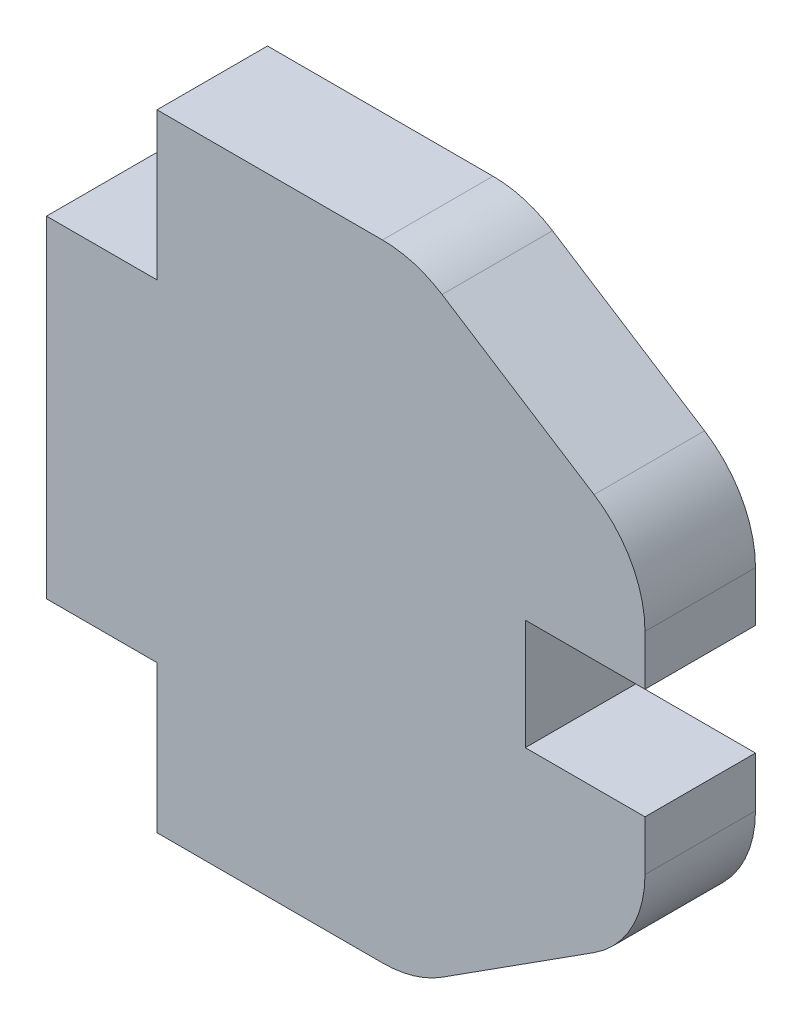
ISO-10303-21;
HEADER;
FILE_DESCRIPTION(('STEP AP214'),'2;1');
FILE_NAME('part.step','',(''),(''),'','','');
FILE_SCHEMA(('AUTOMOTIVE_DESIGN { 1 0 10303 214 1 1 1 1 }'));
ENDSEC;
DATA;
#1=APPLICATION_CONTEXT('core data for automotive mechanical design processes');
#2=APPLICATION_PROTOCOL_DEFINITION('international standard','automotive_design',2000,#1);
#3=PRODUCT_CONTEXT('',#1,'mechanical');
#4=PRODUCT('Part','Part','',(#3));
#5=PRODUCT_RELATED_PRODUCT_CATEGORY('part','',(#4));
#6=PRODUCT_DEFINITION_FORMATION('','',#4);
#7=PRODUCT_DEFINITION_CONTEXT('part definition',#1,'design');
#8=PRODUCT_DEFINITION('design','',#6,#7);
#9=PRODUCT_DEFINITION_SHAPE('','',#8);
#10=(LENGTH_UNIT() NAMED_UNIT(*) SI_UNIT(.MILLI.,.METRE.));
#11=(NAMED_UNIT(*) PLANE_ANGLE_UNIT() SI_UNIT($,.RADIAN.));
#12=(NAMED_UNIT(*) SI_UNIT($,.STERADIAN.) SOLID_ANGLE_UNIT());
#13=UNCERTAINTY_MEASURE_WITH_UNIT(LENGTH_MEASURE(1.E-05),#10,'distance_accuracy_value','');
#14=(GEOMETRIC_REPRESENTATION_CONTEXT(3) GLOBAL_UNCERTAINTY_ASSIGNED_CONTEXT((#13)) GLOBAL_UNIT_ASSIGNED_CONTEXT((#10,
#11,#12)) REPRESENTATION_CONTEXT('',''));
#15=CARTESIAN_POINT('',(0.,0.,0.));
#16=DIRECTION('',(0.,0.,1.));
#17=DIRECTION('',(1.,0.,0.));
#18=AXIS2_PLACEMENT_3D('',#15,#16,#17);
#19=CARTESIAN_POINT('',(6.1221212838,5.4999999982,0.));
#20=DIRECTION('',(0.,0.,1.));
#21=DIRECTION('',(1.,0.,0.));
#22=AXIS2_PLACEMENT_3D('',#19,#20,#21);
#23=CYLINDRICAL_SURFACE('',#22,2.9999999944);
#24=DIRECTION('',(0.,0.,-1.));
#25=VECTOR('',#24,1.);
#26=CARTESIAN_POINT('',(6.1221212838,8.4999999926,1.4999999972));
#27=LINE('',#26,#25);
#28=CARTESIAN_POINT('',(6.1221212838,8.4999999926,2.9999999944));
#29=VERTEX_POINT('',#28);
#30=CARTESIAN_POINT('',(6.1221212838,8.4999999926,0.));
#31=VERTEX_POINT('',#30);
#32=EDGE_CURVE('E101',#29,#31,#27,.T.);
#33=ORIENTED_EDGE('',*,*,#32,.F.);
#34=CARTESIAN_POINT('',(6.1221212838,5.4999999982,2.9999999944));
#35=DIRECTION('',(0.,0.,1.));
#36=DIRECTION('',(1.,0.,0.));
#37=AXIS2_PLACEMENT_3D('',#34,#35,#36);
#38=CIRCLE('',#37,2.9999999944);
#39=CARTESIAN_POINT('',(7.73939168209963,8.02674423565428,2.9999999944));
#40=VERTEX_POINT('',#39);
#41=EDGE_CURVE('E20',#40,#29,#38,.T.);
#42=ORIENTED_EDGE('',*,*,#41,.F.);
#43=DIRECTION('',(0.,0.,1.));
#44=VECTOR('',#43,1.);
#45=CARTESIAN_POINT('',(7.739391684,8.0267442462,1.4999999972));
#46=LINE('',#45,#44);
#47=CARTESIAN_POINT('',(7.73939168946474,8.02674424270224,0.));
#48=VERTEX_POINT('',#47);
#49=EDGE_CURVE('E102',#48,#40,#46,.T.);
#50=ORIENTED_EDGE('',*,*,#49,.F.);
#51=CARTESIAN_POINT('',(6.1221212838,5.4999999982,0.));
#52=DIRECTION('',(0.,0.,1.));
#53=DIRECTION('',(1.,0.,0.));
#54=AXIS2_PLACEMENT_3D('',#51,#52,#53);
#55=CIRCLE('',#54,2.9999999944);
#56=EDGE_CURVE('E106',#31,#48,#55,.F.);
#57=ORIENTED_EDGE('',*,*,#56,.F.);
#58=EDGE_LOOP('',(#33,#42,#50,#57));
#59=FACE_BOUND('',#58,.T.);
#60=ADVANCED_FACE('F16',(#59),#23,.T.);
#61=CARTESIAN_POINT('',(13.2494045146,1.4999999972,0.));
#62=DIRECTION('',(1.,0.,0.));
#63=DIRECTION('',(0.,1.,0.));
#64=AXIS2_PLACEMENT_3D('',#61,#62,#63);
#65=PLANE('',#64);
#66=DIRECTION('',(0.,-1.,0.));
#67=VECTOR('',#66,1.);
#68=CARTESIAN_POINT('',(13.2494045146,2.1791435081,2.9999999944));
#69=LINE('',#68,#67);
#70=CARTESIAN_POINT('',(13.2494045146,2.858287019,2.9999999944));
#71=VERTEX_POINT('',#70);
#72=CARTESIAN_POINT('',(13.2494045146,1.49999999707353,2.9999999944));
#73=VERTEX_POINT('',#72);
#74=EDGE_CURVE('E117',#71,#73,#69,.T.);
#75=ORIENTED_EDGE('',*,*,#74,.T.);
#76=DIRECTION('',(0.,0.,1.));
#77=VECTOR('',#76,1.);
#78=CARTESIAN_POINT('',(13.2494045146,1.4999999972,1.4999999972));
#79=LINE('',#78,#77);
#80=CARTESIAN_POINT('',(13.2494045146,1.49999999713677,0.));
#81=VERTEX_POINT('',#80);
#82=EDGE_CURVE('E202',#81,#73,#79,.T.);
#83=ORIENTED_EDGE('',*,*,#82,.F.);
#84=DIRECTION('',(0.,1.,0.));
#85=VECTOR('',#84,1.);
#86=CARTESIAN_POINT('',(13.2494045146,2.1791435081,0.));
#87=LINE('',#86,#85);
#88=CARTESIAN_POINT('',(13.2494045146,2.858287019,0.));
#89=VERTEX_POINT('',#88);
#90=EDGE_CURVE('E116',#81,#89,#87,.T.);
#91=ORIENTED_EDGE('',*,*,#90,.T.);
#92=DIRECTION('',(0.,0.,-1.));
#93=VECTOR('',#92,1.);
#94=CARTESIAN_POINT('',(13.2494045146,2.858287019,1.4999999972));
#95=LINE('',#94,#93);
#96=EDGE_CURVE('E88',#89,#71,#95,.F.);
#97=ORIENTED_EDGE('',*,*,#96,.T.);
#98=EDGE_LOOP('',(#75,#83,#91,#97));
#99=FACE_BOUND('',#98,.T.);
#100=ADVANCED_FACE('F386',(#99),#65,.T.);
#101=CARTESIAN_POINT('',(13.2494045146,-2.858287019,0.));
#102=DIRECTION('',(1.,0.,0.));
#103=DIRECTION('',(0.,1.,0.));
#104=AXIS2_PLACEMENT_3D('',#101,#102,#103);
#105=PLANE('',#104);
#106=DIRECTION('',(0.,-1.,0.));
#107=VECTOR('',#106,1.);
#108=CARTESIAN_POINT('',(13.2494045146,-2.1791435081,2.9999999944));
#109=LINE('',#108,#107);
#110=CARTESIAN_POINT('',(13.2494045146,-1.49999999703137,2.9999999944));
#111=VERTEX_POINT('',#110);
#112=CARTESIAN_POINT('',(13.2494045146,-2.85828701926938,2.9999999944));
#113=VERTEX_POINT('',#112);
#114=EDGE_CURVE('E246',#111,#113,#109,.T.);
#115=ORIENTED_EDGE('',*,*,#114,.T.);
#116=DIRECTION('',(0.,0.,1.));
#117=VECTOR('',#116,1.);
#118=CARTESIAN_POINT('',(13.2494045146,-2.85828701953876,1.4999999972));
#119=LINE('',#118,#117);
#120=CARTESIAN_POINT('',(13.2494045146,-2.85828701926938,0.));
#121=VERTEX_POINT('',#120);
#122=EDGE_CURVE('E107',#113,#121,#119,.F.);
#123=ORIENTED_EDGE('',*,*,#122,.T.);
#124=DIRECTION('',(0.,1.,0.));
#125=VECTOR('',#124,1.);
#126=CARTESIAN_POINT('',(13.2494045146,0.,0.));
#127=LINE('',#126,#125);
#128=CARTESIAN_POINT('',(13.2494045146,-1.49999999686275,0.));
#129=VERTEX_POINT('',#128);
#130=EDGE_CURVE('E114',#121,#129,#127,.T.);
#131=ORIENTED_EDGE('',*,*,#130,.T.);
#132=DIRECTION('',(0.,0.,-1.));
#133=VECTOR('',#132,1.);
#134=CARTESIAN_POINT('',(13.2494045146,-1.4999999972,1.4999999972));
#135=LINE('',#134,#133);
#136=EDGE_CURVE('E205',#111,#129,#135,.T.);
#137=ORIENTED_EDGE('',*,*,#136,.F.);
#138=EDGE_LOOP('',(#115,#123,#131,#137));
#139=FACE_BOUND('',#138,.T.);
#140=ADVANCED_FACE('F367',(#139),#105,.T.);
#141=CARTESIAN_POINT('',(10.2494045202,2.858287019,0.));
#142=DIRECTION('',(0.,0.,1.));
#143=DIRECTION('',(1.,0.,0.));
#144=AXIS2_PLACEMENT_3D('',#141,#142,#143);
#145=CYLINDRICAL_SURFACE('',#144,2.9999999944);
#146=DIRECTION('',(0.,0.,-1.));
#147=VECTOR('',#146,1.);
#148=CARTESIAN_POINT('',(11.8666749204,5.385031267,1.4999999972));
#149=LINE('',#148,#147);
#150=CARTESIAN_POINT('',(11.8666749206163,5.38503125976128,2.9999999944));
#151=VERTEX_POINT('',#150);
#152=CARTESIAN_POINT('',(11.8666749258647,5.38503126350224,0.));
#153=VERTEX_POINT('',#152);
#154=EDGE_CURVE('E68',#151,#153,#149,.T.);
#155=ORIENTED_EDGE('',*,*,#154,.F.);
#156=CARTESIAN_POINT('',(10.2494045202,2.858287019,2.9999999944));
#157=DIRECTION('',(0.,0.,1.));
#158=DIRECTION('',(1.,0.,0.));
#159=AXIS2_PLACEMENT_3D('',#156,#157,#158);
#160=CIRCLE('',#159,2.9999999944);
#161=EDGE_CURVE('E139',#71,#151,#160,.T.);
#162=ORIENTED_EDGE('',*,*,#161,.F.);
#163=ORIENTED_EDGE('',*,*,#96,.F.);
#164=CARTESIAN_POINT('',(10.2494045202,2.858287019,0.));
#165=DIRECTION('',(0.,0.,1.));
#166=DIRECTION('',(1.,0.,0.));
#167=AXIS2_PLACEMENT_3D('',#164,#165,#166);
#168=CIRCLE('',#167,2.9999999944);
#169=EDGE_CURVE('E85',#89,#153,#168,.T.);
#170=ORIENTED_EDGE('',*,*,#169,.T.);
#171=EDGE_LOOP('',(#155,#162,#163,#170));
#172=FACE_BOUND('',#171,.T.);
#173=ADVANCED_FACE('F86',(#172),#145,.T.);
#174=CARTESIAN_POINT('',(11.8666749204,5.385031267,0.));
#175=DIRECTION('',(0.539090135780362,0.842248078361899,0.));
#176=DIRECTION('',(-0.842248078361899,0.539090135780362,0.));
#177=AXIS2_PLACEMENT_3D('',#174,#175,#176);
#178=PLANE('',#177);
#179=DIRECTION('',(-0.842248079225794,0.539090134430653,0.));
#180=VECTOR('',#179,1.);
#181=CARTESIAN_POINT('',(11.866674908663,5.38503126031186,2.9999999944));
#182=LINE('',#181,#180);
#183=EDGE_CURVE('E99',#151,#40,#182,.T.);
#184=ORIENTED_EDGE('',*,*,#183,.F.);
#185=ORIENTED_EDGE('',*,*,#154,.T.);
#186=DIRECTION('',(-0.842248078361899,0.539090135780362,0.));
#187=VECTOR('',#186,1.);
#188=CARTESIAN_POINT('',(11.8666749204,5.385031267,0.));
#189=LINE('',#188,#187);
#190=EDGE_CURVE('E92',#153,#48,#189,.T.);
#191=ORIENTED_EDGE('',*,*,#190,.T.);
#192=ORIENTED_EDGE('',*,*,#49,.T.);
#193=EDGE_LOOP('',(#184,#185,#191,#192));
#194=FACE_BOUND('',#193,.T.);
#195=ADVANCED_FACE('F97',(#194),#178,.T.);
#196=CARTESIAN_POINT('',(6.1221212838,8.4999999926,0.));
#197=DIRECTION('',(0.,1.,0.));
#198=DIRECTION('',(-1.,0.,0.));
#199=AXIS2_PLACEMENT_3D('',#196,#197,#198);
#200=PLANE('',#199);
#201=DIRECTION('',(-1.,0.,0.));
#202=VECTOR('',#201,1.);
#203=CARTESIAN_POINT('',(5.1247022601,8.4999999926,2.9999999944));
#204=LINE('',#203,#202);
#205=CARTESIAN_POINT('',(1.51418265946501E-09,8.4999999926,2.9999999944));
#206=VERTEX_POINT('',#205);
#207=EDGE_CURVE('E125',#29,#206,#204,.T.);
#208=ORIENTED_EDGE('',*,*,#207,.F.);
#209=ORIENTED_EDGE('',*,*,#32,.T.);
#210=DIRECTION('',(-1.,0.,0.));
#211=VECTOR('',#210,1.);
#212=CARTESIAN_POINT('',(5.1247022601,8.4999999926,0.));
#213=LINE('',#212,#211);
#214=CARTESIAN_POINT('',(1.51418265946501E-09,8.4999999926,0.));
#215=VERTEX_POINT('',#214);
#216=EDGE_CURVE('E164',#31,#215,#213,.T.);
#217=ORIENTED_EDGE('',*,*,#216,.T.);
#218=DIRECTION('',(0.,0.,-1.));
#219=VECTOR('',#218,1.);
#220=CARTESIAN_POINT('',(0.,8.4999999926,1.4999999972));
#221=LINE('',#220,#219);
#222=EDGE_CURVE('E129',#206,#215,#221,.T.);
#223=ORIENTED_EDGE('',*,*,#222,.F.);
#224=EDGE_LOOP('',(#208,#209,#217,#223));
#225=FACE_BOUND('',#224,.T.);
#226=ADVANCED_FACE('F132',(#225),#200,.T.);
#227=CARTESIAN_POINT('',(0.,8.4999999926,0.));
#228=DIRECTION('',(-1.,0.,0.));
#229=DIRECTION('',(0.,-1.,0.));
#230=AXIS2_PLACEMENT_3D('',#227,#228,#229);
#231=PLANE('',#230);
#232=DIRECTION('',(0.,-1.,0.));
#233=VECTOR('',#232,1.);
#234=CARTESIAN_POINT('',(2.2712738807773E-09,0.,2.9999999944));
#235=LINE('',#234,#233);
#236=CARTESIAN_POINT('',(1.51418244262458E-09,4.49999999058824,2.9999999944));
#237=VERTEX_POINT('',#236);
#238=EDGE_CURVE('E135',#206,#237,#235,.T.);
#239=ORIENTED_EDGE('',*,*,#238,.F.);
#240=ORIENTED_EDGE('',*,*,#222,.T.);
#241=DIRECTION('',(0.,-1.,0.));
#242=VECTOR('',#241,1.);
#243=CARTESIAN_POINT('',(2.2712738807773E-09,0.,0.));
#244=LINE('',#243,#242);
#245=CARTESIAN_POINT('',(1.51418244262458E-09,4.49999999084118,0.));
#246=VERTEX_POINT('',#245);
#247=EDGE_CURVE('E166',#215,#246,#244,.T.);
#248=ORIENTED_EDGE('',*,*,#247,.T.);
#249=DIRECTION('',(0.,0.,-1.));
#250=VECTOR('',#249,1.);
#251=CARTESIAN_POINT('',(0.,4.4999999916,1.4999999972));
#252=LINE('',#251,#250);
#253=EDGE_CURVE('E228',#237,#246,#252,.T.);
#254=ORIENTED_EDGE('',*,*,#253,.F.);
#255=EDGE_LOOP('',(#239,#240,#248,#254));
#256=FACE_BOUND('',#255,.T.);
#257=ADVANCED_FACE('F413',(#256),#231,.T.);
#258=CARTESIAN_POINT('',(0.,4.4999999916,0.));
#259=DIRECTION('',(0.,1.,0.));
#260=DIRECTION('',(-1.,0.,0.));
#261=AXIS2_PLACEMENT_3D('',#258,#259,#260);
#262=PLANE('',#261);
#263=DIRECTION('',(-1.,0.,0.));
#264=VECTOR('',#263,1.);
#265=CARTESIAN_POINT('',(5.1247022601,4.49999999008236,2.9999999944));
#266=LINE('',#265,#264);
#267=CARTESIAN_POINT('',(-2.9999999944,4.49999999058824,2.9999999944));
#268=VERTEX_POINT('',#267);
#269=EDGE_CURVE('E137',#237,#268,#266,.T.);
#270=ORIENTED_EDGE('',*,*,#269,.F.);
#271=ORIENTED_EDGE('',*,*,#253,.T.);
#272=DIRECTION('',(-1.,0.,0.));
#273=VECTOR('',#272,1.);
#274=CARTESIAN_POINT('',(5.1247022601,4.49999999008236,0.));
#275=LINE('',#274,#273);
#276=CARTESIAN_POINT('',(-2.9999999944,4.49999999058824,0.));
#277=VERTEX_POINT('',#276);
#278=EDGE_CURVE('E266',#246,#277,#275,.T.);
#279=ORIENTED_EDGE('',*,*,#278,.T.);
#280=DIRECTION('',(0.,0.,-1.));
#281=VECTOR('',#280,1.);
#282=CARTESIAN_POINT('',(-2.9999999944,4.4999999916,1.4999999972));
#283=LINE('',#282,#281);
#284=EDGE_CURVE('E219',#268,#277,#283,.T.);
#285=ORIENTED_EDGE('',*,*,#284,.F.);
#286=EDGE_LOOP('',(#270,#271,#279,#285));
#287=FACE_BOUND('',#286,.T.);
#288=ADVANCED_FACE('F418',(#287),#262,.T.);
#289=CARTESIAN_POINT('',(-2.9999999944,4.4999999916,0.));
#290=DIRECTION('',(-1.,0.,0.));
#291=DIRECTION('',(0.,-1.,0.));
#292=AXIS2_PLACEMENT_3D('',#289,#290,#291);
#293=PLANE('',#292);
#294=DIRECTION('',(0.,-1.,0.));
#295=VECTOR('',#294,1.);
#296=CARTESIAN_POINT('',(-2.9999999944,0.,2.9999999944));
#297=LINE('',#296,#295);
#298=CARTESIAN_POINT('',(-2.9999999944,-4.49999999058824,2.9999999944));
#299=VERTEX_POINT('',#298);
#300=EDGE_CURVE('E213',#268,#299,#297,.T.);
#301=ORIENTED_EDGE('',*,*,#300,.F.);
#302=ORIENTED_EDGE('',*,*,#284,.T.);
#303=DIRECTION('',(0.,-1.,0.));
#304=VECTOR('',#303,1.);
#305=CARTESIAN_POINT('',(-2.9999999944,0.,0.));
#306=LINE('',#305,#304);
#307=CARTESIAN_POINT('',(-2.9999999944,-4.49999999084118,0.));
#308=VERTEX_POINT('',#307);
#309=EDGE_CURVE('E261',#277,#308,#306,.T.);
#310=ORIENTED_EDGE('',*,*,#309,.T.);
#311=DIRECTION('',(0.,0.,-1.));
#312=VECTOR('',#311,1.);
#313=CARTESIAN_POINT('',(-2.9999999944,-4.4999999916,1.4999999972));
#314=LINE('',#313,#312);
#315=EDGE_CURVE('E216',#299,#308,#314,.T.);
#316=ORIENTED_EDGE('',*,*,#315,.F.);
#317=EDGE_LOOP('',(#301,#302,#310,#316));
#318=FACE_BOUND('',#317,.T.);
#319=ADVANCED_FACE('F422',(#318),#293,.T.);
#320=CARTESIAN_POINT('',(-2.9999999944,-4.4999999916,0.));
#321=DIRECTION('',(0.,-1.,0.));
#322=DIRECTION('',(1.,0.,0.));
#323=AXIS2_PLACEMENT_3D('',#320,#321,#322);
#324=PLANE('',#323);
#325=DIRECTION('',(1.,0.,0.));
#326=VECTOR('',#325,1.);
#327=CARTESIAN_POINT('',(5.1247022601,-4.49999999008235,2.9999999944));
#328=LINE('',#327,#326);
#329=CARTESIAN_POINT('',(1.51418273174516E-09,-4.49999999058824,2.9999999944));
#330=VERTEX_POINT('',#329);
#331=EDGE_CURVE('E182',#299,#330,#328,.T.);
#332=ORIENTED_EDGE('',*,*,#331,.F.);
#333=ORIENTED_EDGE('',*,*,#315,.T.);
#334=DIRECTION('',(1.,0.,0.));
#335=VECTOR('',#334,1.);
#336=CARTESIAN_POINT('',(5.1247022601,-4.49999999008235,0.));
#337=LINE('',#336,#335);
#338=CARTESIAN_POINT('',(1.13563686810851E-09,-4.49999999058824,0.));
#339=VERTEX_POINT('',#338);
#340=EDGE_CURVE('E196',#308,#339,#337,.T.);
#341=ORIENTED_EDGE('',*,*,#340,.T.);
#342=DIRECTION('',(0.,0.,-1.));
#343=VECTOR('',#342,1.);
#344=CARTESIAN_POINT('',(0.,-4.4999999916,1.4999999972));
#345=LINE('',#344,#343);
#346=EDGE_CURVE('E167',#330,#339,#345,.T.);
#347=ORIENTED_EDGE('',*,*,#346,.F.);
#348=EDGE_LOOP('',(#332,#333,#341,#347));
#349=FACE_BOUND('',#348,.T.);
#350=ADVANCED_FACE('F426',(#349),#324,.T.);
#351=CARTESIAN_POINT('',(13.2494045146,-1.4999999972,0.));
#352=DIRECTION('',(0.,1.,0.));
#353=DIRECTION('',(-1.,0.,0.));
#354=AXIS2_PLACEMENT_3D('',#351,#352,#353);
#355=PLANE('',#354);
#356=DIRECTION('',(-1.,0.,0.));
#357=VECTOR('',#356,1.);
#358=CARTESIAN_POINT('',(5.1247022601,-1.49999999669412,2.9999999944));
#359=LINE('',#358,#357);
#360=CARTESIAN_POINT('',(9.999999991498,-1.49999999707353,2.9999999944));
#361=VERTEX_POINT('',#360);
#362=EDGE_CURVE('E277',#111,#361,#359,.T.);
#363=ORIENTED_EDGE('',*,*,#362,.F.);
#364=ORIENTED_EDGE('',*,*,#136,.T.);
#365=DIRECTION('',(-1.,0.,0.));
#366=VECTOR('',#365,1.);
#367=CARTESIAN_POINT('',(5.1247022601,-1.49999999669412,0.));
#368=LINE('',#367,#366);
#369=CARTESIAN_POINT('',(9.999999991498,-1.49999999707353,0.));
#370=VERTEX_POINT('',#369);
#371=EDGE_CURVE('E159',#129,#370,#368,.T.);
#372=ORIENTED_EDGE('',*,*,#371,.T.);
#373=DIRECTION('',(0.,0.,-1.));
#374=VECTOR('',#373,1.);
#375=CARTESIAN_POINT('',(9.9999999898,-1.4999999972,1.4999999972));
#376=LINE('',#375,#374);
#377=EDGE_CURVE('E203',#361,#370,#376,.T.);
#378=ORIENTED_EDGE('',*,*,#377,.F.);
#379=EDGE_LOOP('',(#363,#364,#372,#378));
#380=FACE_BOUND('',#379,.T.);
#381=ADVANCED_FACE('F374',(#380),#355,.T.);
#382=CARTESIAN_POINT('',(9.9999999898,-1.4999999972,0.));
#383=DIRECTION('',(1.,0.,0.));
#384=DIRECTION('',(0.,1.,0.));
#385=AXIS2_PLACEMENT_3D('',#382,#383,#384);
#386=PLANE('',#385);
#387=DIRECTION('',(0.,1.,0.));
#388=VECTOR('',#387,1.);
#389=CARTESIAN_POINT('',(9.99999999659199,0.,2.9999999944));
#390=LINE('',#389,#388);
#391=CARTESIAN_POINT('',(9.999999991498,1.49999999707353,2.9999999944));
#392=VERTEX_POINT('',#391);
#393=EDGE_CURVE('E143',#361,#392,#390,.T.);
#394=ORIENTED_EDGE('',*,*,#393,.F.);
#395=ORIENTED_EDGE('',*,*,#377,.T.);
#396=DIRECTION('',(0.,1.,0.));
#397=VECTOR('',#396,1.);
#398=CARTESIAN_POINT('',(9.99999999659199,0.,0.));
#399=LINE('',#398,#397);
#400=CARTESIAN_POINT('',(9.999999991498,1.49999999707353,0.));
#401=VERTEX_POINT('',#400);
#402=EDGE_CURVE('E156',#370,#401,#399,.T.);
#403=ORIENTED_EDGE('',*,*,#402,.T.);
#404=DIRECTION('',(0.,0.,-1.));
#405=VECTOR('',#404,1.);
#406=CARTESIAN_POINT('',(9.9999999898,1.4999999972,1.4999999972));
#407=LINE('',#406,#405);
#408=EDGE_CURVE('E199',#392,#401,#407,.T.);
#409=ORIENTED_EDGE('',*,*,#408,.F.);
#410=EDGE_LOOP('',(#394,#395,#403,#409));
#411=FACE_BOUND('',#410,.T.);
#412=ADVANCED_FACE('F378',(#411),#386,.T.);
#413=CARTESIAN_POINT('',(9.9999999898,1.4999999972,0.));
#414=DIRECTION('',(0.,-1.,0.));
#415=DIRECTION('',(1.,0.,0.));
#416=AXIS2_PLACEMENT_3D('',#413,#414,#415);
#417=PLANE('',#416);
#418=DIRECTION('',(1.,0.,0.));
#419=VECTOR('',#418,1.);
#420=CARTESIAN_POINT('',(5.1247022601,1.49999999669412,2.9999999944));
#421=LINE('',#420,#419);
#422=EDGE_CURVE('E191',#392,#73,#421,.T.);
#423=ORIENTED_EDGE('',*,*,#422,.F.);
#424=ORIENTED_EDGE('',*,*,#408,.T.);
#425=DIRECTION('',(1.,0.,0.));
#426=VECTOR('',#425,1.);
#427=CARTESIAN_POINT('',(5.1247022601,1.49999999669412,0.));
#428=LINE('',#427,#426);
#429=EDGE_CURVE('E93',#401,#81,#428,.T.);
#430=ORIENTED_EDGE('',*,*,#429,.T.);
#431=ORIENTED_EDGE('',*,*,#82,.T.);
#432=EDGE_LOOP('',(#423,#424,#430,#431));
#433=FACE_BOUND('',#432,.T.);
#434=ADVANCED_FACE('F383',(#433),#417,.T.);
#435=CARTESIAN_POINT('',(0.,-4.4999999916,0.));
#436=DIRECTION('',(-1.,0.,0.));
#437=DIRECTION('',(0.,-1.,0.));
#438=AXIS2_PLACEMENT_3D('',#435,#436,#437);
#439=PLANE('',#438);
#440=DIRECTION('',(0.,-1.,0.));
#441=VECTOR('',#440,1.);
#442=CARTESIAN_POINT('',(2.2712738807773E-09,0.,2.9999999944));
#443=LINE('',#442,#441);
#444=CARTESIAN_POINT('',(7.57091293592434E-10,-8.4999999926,2.9999999944));
#445=VERTEX_POINT('',#444);
#446=EDGE_CURVE('E178',#330,#445,#443,.T.);
#447=ORIENTED_EDGE('',*,*,#446,.F.);
#448=ORIENTED_EDGE('',*,*,#346,.T.);
#449=DIRECTION('',(0.,-1.,0.));
#450=VECTOR('',#449,1.);
#451=CARTESIAN_POINT('',(2.2712738807773E-09,0.,0.));
#452=LINE('',#451,#450);
#453=CARTESIAN_POINT('',(1.1356370126688E-09,-8.4999999926,0.));
#454=VERTEX_POINT('',#453);
#455=EDGE_CURVE('E115',#339,#454,#452,.T.);
#456=ORIENTED_EDGE('',*,*,#455,.T.);
#457=DIRECTION('',(0.,0.,-1.));
#458=VECTOR('',#457,1.);
#459=CARTESIAN_POINT('',(0.,-8.4999999926,1.4999999972));
#460=LINE('',#459,#458);
#461=EDGE_CURVE('E155',#445,#454,#460,.T.);
#462=ORIENTED_EDGE('',*,*,#461,.F.);
#463=EDGE_LOOP('',(#447,#448,#456,#462));
#464=FACE_BOUND('',#463,.T.);
#465=ADVANCED_FACE('F437',(#464),#439,.T.);
#466=CARTESIAN_POINT('',(-2.9999999944,-8.4999999926,0.));
#467=DIRECTION('',(0.,0.,1.));
#468=DIRECTION('',(1.,0.,0.));
#469=AXIS2_PLACEMENT_3D('',#466,#467,#468);
#470=PLANE('',#469);
#471=ORIENTED_EDGE('',*,*,#190,.F.);
#472=ORIENTED_EDGE('',*,*,#169,.F.);
#473=ORIENTED_EDGE('',*,*,#90,.F.);
#474=ORIENTED_EDGE('',*,*,#429,.F.);
#475=ORIENTED_EDGE('',*,*,#402,.F.);
#476=ORIENTED_EDGE('',*,*,#371,.F.);
#477=ORIENTED_EDGE('',*,*,#130,.F.);
#478=CARTESIAN_POINT('',(10.2494045202,-2.858287019,0.));
#479=DIRECTION('',(0.,0.,1.));
#480=DIRECTION('',(1.,0.,0.));
#481=AXIS2_PLACEMENT_3D('',#478,#479,#480);
#482=CIRCLE('',#481,2.9999999944);
#483=CARTESIAN_POINT('',(11.8666749258647,-5.38503126350224,0.));
#484=VERTEX_POINT('',#483);
#485=EDGE_CURVE('E109',#121,#484,#482,.F.);
#486=ORIENTED_EDGE('',*,*,#485,.T.);
#487=DIRECTION('',(0.842248078361899,0.539090135780362,0.));
#488=VECTOR('',#487,1.);
#489=CARTESIAN_POINT('',(9.8030333022,-6.7058877566,0.));
#490=LINE('',#489,#488);
#491=CARTESIAN_POINT('',(7.73939168863847,-8.02674423573487,0.));
#492=VERTEX_POINT('',#491);
#493=EDGE_CURVE('E150',#492,#484,#490,.T.);
#494=ORIENTED_EDGE('',*,*,#493,.F.);
#495=CARTESIAN_POINT('',(6.1221212838,-5.4999999982,0.));
#496=DIRECTION('',(0.,0.,1.));
#497=DIRECTION('',(1.,0.,0.));
#498=AXIS2_PLACEMENT_3D('',#495,#496,#497);
#499=CIRCLE('',#498,2.9999999944);
#500=CARTESIAN_POINT('',(6.12212128322297,-8.4999999926,0.));
#501=VERTEX_POINT('',#500);
#502=EDGE_CURVE('E35',#501,#492,#499,.T.);
#503=ORIENTED_EDGE('',*,*,#502,.F.);
#504=DIRECTION('',(1.,0.,0.));
#505=VECTOR('',#504,1.);
#506=CARTESIAN_POINT('',(3.0610606419,-8.4999999926,0.));
#507=LINE('',#506,#505);
#508=EDGE_CURVE('E175',#454,#501,#507,.T.);
#509=ORIENTED_EDGE('',*,*,#508,.F.);
#510=ORIENTED_EDGE('',*,*,#455,.F.);
#511=ORIENTED_EDGE('',*,*,#340,.F.);
#512=ORIENTED_EDGE('',*,*,#309,.F.);
#513=ORIENTED_EDGE('',*,*,#278,.F.);
#514=ORIENTED_EDGE('',*,*,#247,.F.);
#515=ORIENTED_EDGE('',*,*,#216,.F.);
#516=ORIENTED_EDGE('',*,*,#56,.T.);
#517=EDGE_LOOP('',(#471,#472,#473,#474,#475,#476,#477,#486,#494,#503,#509,#510,#511,#512,#513,
#514,#515,#516));
#518=FACE_BOUND('',#517,.T.);
#519=ADVANCED_FACE('F104',(#518),#470,.F.);
#520=CARTESIAN_POINT('',(10.2494045202,-2.858287019,0.));
#521=DIRECTION('',(0.,0.,1.));
#522=DIRECTION('',(1.,0.,0.));
#523=AXIS2_PLACEMENT_3D('',#520,#521,#522);
#524=CYLINDRICAL_SURFACE('',#523,2.9999999944);
#525=ORIENTED_EDGE('',*,*,#122,.F.);
#526=CARTESIAN_POINT('',(10.2494045202,-2.858287019,2.9999999944));
#527=DIRECTION('',(0.,0.,1.));
#528=DIRECTION('',(1.,0.,0.));
#529=AXIS2_PLACEMENT_3D('',#526,#527,#528);
#530=CIRCLE('',#529,2.9999999944);
#531=CARTESIAN_POINT('',(11.8666749258647,-5.38503126350224,2.9999999944));
#532=VERTEX_POINT('',#531);
#533=EDGE_CURVE('E280',#532,#113,#530,.T.);
#534=ORIENTED_EDGE('',*,*,#533,.F.);
#535=DIRECTION('',(0.,0.,1.));
#536=VECTOR('',#535,1.);
#537=CARTESIAN_POINT('',(11.8666749204,-5.385031267,1.4999999972));
#538=LINE('',#537,#536);
#539=EDGE_CURVE('E146',#484,#532,#538,.T.);
#540=ORIENTED_EDGE('',*,*,#539,.F.);
#541=ORIENTED_EDGE('',*,*,#485,.F.);
#542=EDGE_LOOP('',(#525,#534,#540,#541));
#543=FACE_BOUND('',#542,.T.);
#544=ADVANCED_FACE('F309',(#543),#524,.T.);
#545=CARTESIAN_POINT('',(-2.9999999944,-8.4999999926,2.9999999944));
#546=DIRECTION('',(0.,0.,1.));
#547=DIRECTION('',(1.,0.,0.));
#548=AXIS2_PLACEMENT_3D('',#545,#546,#547);
#549=PLANE('',#548);
#550=ORIENTED_EDGE('',*,*,#422,.T.);
#551=ORIENTED_EDGE('',*,*,#74,.F.);
#552=ORIENTED_EDGE('',*,*,#161,.T.);
#553=ORIENTED_EDGE('',*,*,#183,.T.);
#554=ORIENTED_EDGE('',*,*,#41,.T.);
#555=ORIENTED_EDGE('',*,*,#207,.T.);
#556=ORIENTED_EDGE('',*,*,#238,.T.);
#557=ORIENTED_EDGE('',*,*,#269,.T.);
#558=ORIENTED_EDGE('',*,*,#300,.T.);
#559=ORIENTED_EDGE('',*,*,#331,.T.);
#560=ORIENTED_EDGE('',*,*,#446,.T.);
#561=DIRECTION('',(-1.,0.,0.));
#562=VECTOR('',#561,1.);
#563=CARTESIAN_POINT('',(3.0610606419,-8.4999999926,2.9999999944));
#564=LINE('',#563,#562);
#565=CARTESIAN_POINT('',(6.12212128322297,-8.4999999926,2.9999999944));
#566=VERTEX_POINT('',#565);
#567=EDGE_CURVE('E172',#566,#445,#564,.T.);
#568=ORIENTED_EDGE('',*,*,#567,.F.);
#569=CARTESIAN_POINT('',(6.1221212838,-5.4999999982,2.9999999944));
#570=DIRECTION('',(0.,0.,1.));
#571=DIRECTION('',(1.,0.,0.));
#572=AXIS2_PLACEMENT_3D('',#569,#570,#571);
#573=CIRCLE('',#572,2.9999999944);
#574=CARTESIAN_POINT('',(7.73939168863847,-8.02674423573487,2.9999999944));
#575=VERTEX_POINT('',#574);
#576=EDGE_CURVE('E181',#566,#575,#573,.T.);
#577=ORIENTED_EDGE('',*,*,#576,.T.);
#578=DIRECTION('',(-0.842248078361899,-0.539090135780362,0.));
#579=VECTOR('',#578,1.);
#580=CARTESIAN_POINT('',(9.8030333022,-6.7058877566,2.9999999944));
#581=LINE('',#580,#579);
#582=EDGE_CURVE('E149',#532,#575,#581,.T.);
#583=ORIENTED_EDGE('',*,*,#582,.F.);
#584=ORIENTED_EDGE('',*,*,#533,.T.);
#585=ORIENTED_EDGE('',*,*,#114,.F.);
#586=ORIENTED_EDGE('',*,*,#362,.T.);
#587=ORIENTED_EDGE('',*,*,#393,.T.);
#588=EDGE_LOOP('',(#550,#551,#552,#553,#554,#555,#556,#557,#558,#559,#560,#568,#577,#583,#584,
#585,#586,#587));
#589=FACE_BOUND('',#588,.T.);
#590=ADVANCED_FACE('F122',(#589),#549,.T.);
#591=CARTESIAN_POINT('',(0.,-8.4999999926,0.));
#592=DIRECTION('',(0.,-1.,0.));
#593=DIRECTION('',(1.,0.,0.));
#594=AXIS2_PLACEMENT_3D('',#591,#592,#593);
#595=PLANE('',#594);
#596=ORIENTED_EDGE('',*,*,#567,.T.);
#597=ORIENTED_EDGE('',*,*,#461,.T.);
#598=ORIENTED_EDGE('',*,*,#508,.T.);
#599=DIRECTION('',(0.,0.,-1.));
#600=VECTOR('',#599,1.);
#601=CARTESIAN_POINT('',(6.12212128264593,-8.4999999926,1.4999999972));
#602=LINE('',#601,#600);
#603=EDGE_CURVE('E26',#501,#566,#602,.F.);
#604=ORIENTED_EDGE('',*,*,#603,.T.);
#605=EDGE_LOOP('',(#596,#597,#598,#604));
#606=FACE_BOUND('',#605,.T.);
#607=ADVANCED_FACE('F319',(#606),#595,.T.);
#608=CARTESIAN_POINT('',(7.739391684,-8.0267442462,0.));
#609=DIRECTION('',(0.539090135780362,-0.842248078361899,0.));
#610=DIRECTION('',(0.842248078361899,0.539090135780362,0.));
#611=AXIS2_PLACEMENT_3D('',#608,#609,#610);
#612=PLANE('',#611);
#613=ORIENTED_EDGE('',*,*,#582,.T.);
#614=DIRECTION('',(0.,0.,1.));
#615=VECTOR('',#614,1.);
#616=CARTESIAN_POINT('',(7.73939168234747,-8.02674423226527,1.4999999972));
#617=LINE('',#616,#615);
#618=EDGE_CURVE('E11',#575,#492,#617,.F.);
#619=ORIENTED_EDGE('',*,*,#618,.T.);
#620=ORIENTED_EDGE('',*,*,#493,.T.);
#621=ORIENTED_EDGE('',*,*,#539,.T.);
#622=EDGE_LOOP('',(#613,#619,#620,#621));
#623=FACE_BOUND('',#622,.T.);
#624=ADVANCED_FACE('F18',(#623),#612,.T.);
#625=CARTESIAN_POINT('',(6.1221212838,-5.4999999982,0.));
#626=DIRECTION('',(0.,0.,1.));
#627=DIRECTION('',(1.,0.,0.));
#628=AXIS2_PLACEMENT_3D('',#625,#626,#627);
#629=CYLINDRICAL_SURFACE('',#628,2.9999999944);
#630=ORIENTED_EDGE('',*,*,#618,.F.);
#631=ORIENTED_EDGE('',*,*,#576,.F.);
#632=ORIENTED_EDGE('',*,*,#603,.F.);
#633=ORIENTED_EDGE('',*,*,#502,.T.);
#634=EDGE_LOOP('',(#630,#631,#632,#633));
#635=FACE_BOUND('',#634,.T.);
#636=ADVANCED_FACE('F313',(#635),#629,.T.);
#637=CLOSED_SHELL('',(#60,#100,#140,#173,#195,#226,#257,#288,#319,#350,#381,#412,#434,#465,#519,
#544,#590,#607,#624,#636));
#638=MANIFOLD_SOLID_BREP('B1',#637);
#639=ADVANCED_BREP_SHAPE_REPRESENTATION('',(#18,#638),#14);
#640=SHAPE_DEFINITION_REPRESENTATION(#9,#639);
ENDSEC;
END-ISO-10303-21;
